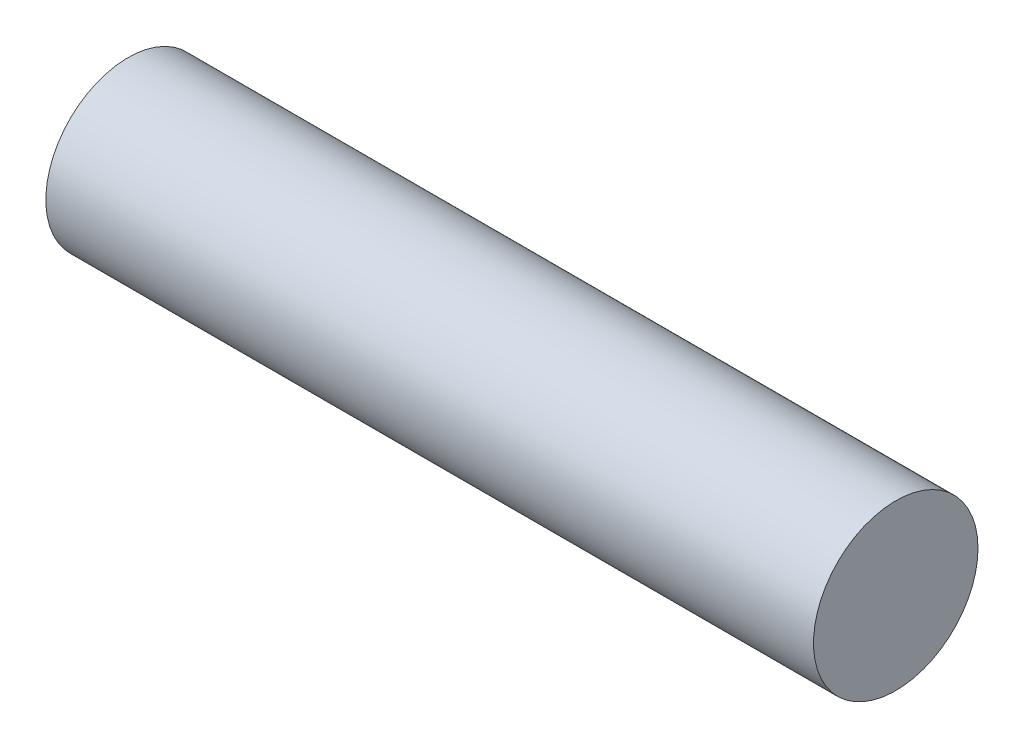
ISO-10303-21;
HEADER;
FILE_DESCRIPTION(('STEP AP214'),'2;1');
FILE_NAME('part.step','',(''),(''),'','','');
FILE_SCHEMA(('AUTOMOTIVE_DESIGN { 1 0 10303 214 1 1 1 1 }'));
ENDSEC;
DATA;
#1=APPLICATION_CONTEXT('core data for automotive mechanical design processes');
#2=APPLICATION_PROTOCOL_DEFINITION('international standard','automotive_design',2000,#1);
#3=PRODUCT_CONTEXT('',#1,'mechanical');
#4=PRODUCT('Part','Part','',(#3));
#5=PRODUCT_RELATED_PRODUCT_CATEGORY('part','',(#4));
#6=PRODUCT_DEFINITION_FORMATION('','',#4);
#7=PRODUCT_DEFINITION_CONTEXT('part definition',#1,'design');
#8=PRODUCT_DEFINITION('design','',#6,#7);
#9=PRODUCT_DEFINITION_SHAPE('','',#8);
#10=(LENGTH_UNIT() NAMED_UNIT(*) SI_UNIT(.MILLI.,.METRE.));
#11=(NAMED_UNIT(*) PLANE_ANGLE_UNIT() SI_UNIT($,.RADIAN.));
#12=(NAMED_UNIT(*) SI_UNIT($,.STERADIAN.) SOLID_ANGLE_UNIT());
#13=UNCERTAINTY_MEASURE_WITH_UNIT(LENGTH_MEASURE(1.E-05),#10,'distance_accuracy_value','');
#14=(GEOMETRIC_REPRESENTATION_CONTEXT(3) GLOBAL_UNCERTAINTY_ASSIGNED_CONTEXT((#13)) GLOBAL_UNIT_ASSIGNED_CONTEXT((#10,
#11,#12)) REPRESENTATION_CONTEXT('',''));
#15=CARTESIAN_POINT('',(0.,0.,0.));
#16=DIRECTION('',(0.,0.,1.));
#17=DIRECTION('',(1.,0.,0.));
#18=AXIS2_PLACEMENT_3D('',#15,#16,#17);
#19=CARTESIAN_POINT('',(14.,0.,0.));
#20=DIRECTION('',(-1.,0.,0.));
#21=DIRECTION('',(0.,0.,1.));
#22=AXIS2_PLACEMENT_3D('',#19,#20,#21);
#23=CYLINDRICAL_SURFACE('',#22,1.5);
#24=CARTESIAN_POINT('',(14.,0.,0.));
#25=DIRECTION('',(1.,0.,0.));
#26=DIRECTION('',(0.,0.,-1.));
#27=AXIS2_PLACEMENT_3D('',#24,#25,#26);
#28=CIRCLE('',#27,1.5);
#29=CARTESIAN_POINT('',(14.,0.,-1.5));
#30=VERTEX_POINT('',#29);
#31=EDGE_CURVE('E10',#30,#30,#28,.T.);
#32=ORIENTED_EDGE('',*,*,#31,.F.);
#33=EDGE_LOOP('',(#32));
#34=FACE_BOUND('',#33,.T.);
#35=CARTESIAN_POINT('',(0.,0.,0.));
#36=DIRECTION('',(1.,0.,0.));
#37=DIRECTION('',(0.,0.,-1.));
#38=AXIS2_PLACEMENT_3D('',#35,#36,#37);
#39=CIRCLE('',#38,1.5);
#40=CARTESIAN_POINT('',(0.,0.,-1.5));
#41=VERTEX_POINT('',#40);
#42=EDGE_CURVE('E37',#41,#41,#39,.T.);
#43=ORIENTED_EDGE('',*,*,#42,.T.);
#44=EDGE_LOOP('',(#43));
#45=FACE_BOUND('',#44,.T.);
#46=ADVANCED_FACE('F34',(#34,#45),#23,.T.);
#47=CARTESIAN_POINT('',(14.,0.,0.));
#48=DIRECTION('',(1.,0.,0.));
#49=DIRECTION('',(0.,0.,-1.));
#50=AXIS2_PLACEMENT_3D('',#47,#48,#49);
#51=PLANE('',#50);
#52=ORIENTED_EDGE('',*,*,#31,.T.);
#53=EDGE_LOOP('',(#52));
#54=FACE_BOUND('',#53,.T.);
#55=ADVANCED_FACE('F49',(#54),#51,.T.);
#56=CARTESIAN_POINT('',(0.,0.,0.));
#57=DIRECTION('',(1.,0.,0.));
#58=DIRECTION('',(0.,0.,-1.));
#59=AXIS2_PLACEMENT_3D('',#56,#57,#58);
#60=PLANE('',#59);
#61=ORIENTED_EDGE('',*,*,#42,.F.);
#62=EDGE_LOOP('',(#61));
#63=FACE_BOUND('',#62,.T.);
#64=ADVANCED_FACE('F47',(#63),#60,.F.);
#65=CLOSED_SHELL('',(#46,#55,#64));
#66=MANIFOLD_SOLID_BREP('B2',#65);
#67=ADVANCED_BREP_SHAPE_REPRESENTATION('',(#18,#66),#14);
#68=SHAPE_DEFINITION_REPRESENTATION(#9,#67);
ENDSEC;
END-ISO-10303-21;
